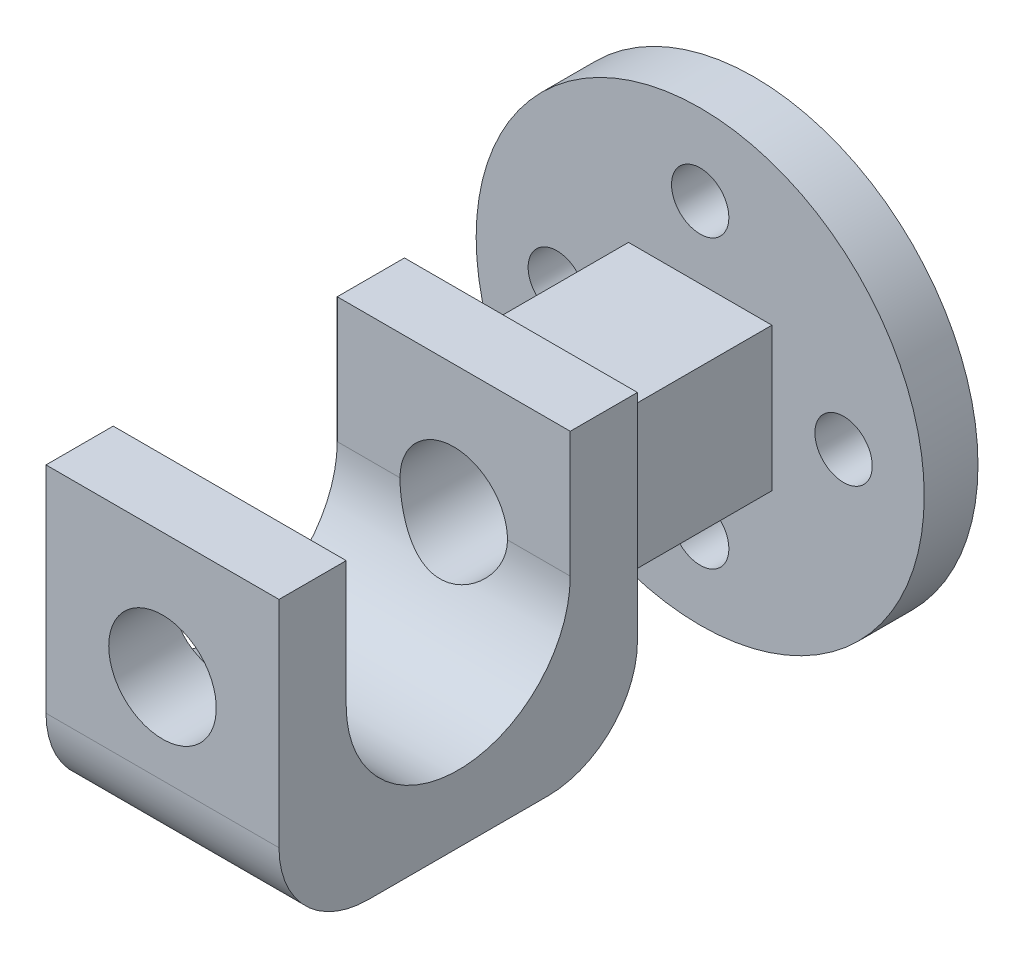
ISO-10303-21;
HEADER;
FILE_DESCRIPTION(('STEP AP214'),'2;1');
FILE_NAME('part.step','',(''),(''),'','','');
FILE_SCHEMA(('AUTOMOTIVE_DESIGN { 1 0 10303 214 1 1 1 1 }'));
ENDSEC;
DATA;
#1=APPLICATION_CONTEXT('core data for automotive mechanical design processes');
#2=APPLICATION_PROTOCOL_DEFINITION('international standard','automotive_design',2000,#1);
#3=PRODUCT_CONTEXT('',#1,'mechanical');
#4=PRODUCT('Part','Part','',(#3));
#5=PRODUCT_RELATED_PRODUCT_CATEGORY('part','',(#4));
#6=PRODUCT_DEFINITION_FORMATION('','',#4);
#7=PRODUCT_DEFINITION_CONTEXT('part definition',#1,'design');
#8=PRODUCT_DEFINITION('design','',#6,#7);
#9=PRODUCT_DEFINITION_SHAPE('','',#8);
#10=(LENGTH_UNIT() NAMED_UNIT(*) SI_UNIT(.MILLI.,.METRE.));
#11=(NAMED_UNIT(*) PLANE_ANGLE_UNIT() SI_UNIT($,.RADIAN.));
#12=(NAMED_UNIT(*) SI_UNIT($,.STERADIAN.) SOLID_ANGLE_UNIT());
#13=UNCERTAINTY_MEASURE_WITH_UNIT(LENGTH_MEASURE(1.E-05),#10,'distance_accuracy_value','');
#14=(GEOMETRIC_REPRESENTATION_CONTEXT(3) GLOBAL_UNCERTAINTY_ASSIGNED_CONTEXT((#13)) GLOBAL_UNIT_ASSIGNED_CONTEXT((#10,
#11,#12)) REPRESENTATION_CONTEXT('',''));
#15=CARTESIAN_POINT('',(0.,0.,0.));
#16=DIRECTION('',(0.,0.,1.));
#17=DIRECTION('',(1.,0.,0.));
#18=AXIS2_PLACEMENT_3D('',#15,#16,#17);
#19=CARTESIAN_POINT('',(0.,0.,3.));
#20=DIRECTION('',(0.,0.,1.));
#21=DIRECTION('',(1.,0.,0.));
#22=AXIS2_PLACEMENT_3D('',#19,#20,#21);
#23=PLANE('',#22);
#24=CARTESIAN_POINT('',(4.51808198568511E-13,-8.,3.));
#25=DIRECTION('',(0.,0.,1.));
#26=DIRECTION('',(1.,0.,0.));
#27=AXIS2_PLACEMENT_3D('',#24,#25,#26);
#28=CIRCLE('',#27,1.6);
#29=CARTESIAN_POINT('',(1.60000000000045,-8.,3.));
#30=VERTEX_POINT('',#29);
#31=EDGE_CURVE('E218',#30,#30,#28,.T.);
#32=ORIENTED_EDGE('',*,*,#31,.F.);
#33=EDGE_LOOP('',(#32));
#34=FACE_BOUND('',#33,.T.);
#35=CARTESIAN_POINT('',(0.,8.,3.));
#36=DIRECTION('',(0.,0.,1.));
#37=DIRECTION('',(1.,0.,0.));
#38=AXIS2_PLACEMENT_3D('',#35,#36,#37);
#39=CIRCLE('',#38,1.6);
#40=CARTESIAN_POINT('',(1.6,8.,3.));
#41=VERTEX_POINT('',#40);
#42=EDGE_CURVE('E230',#41,#41,#39,.T.);
#43=ORIENTED_EDGE('',*,*,#42,.F.);
#44=EDGE_LOOP('',(#43));
#45=FACE_BOUND('',#44,.T.);
#46=CARTESIAN_POINT('',(0.,0.,3.));
#47=DIRECTION('',(0.,0.,1.));
#48=DIRECTION('',(1.,0.,0.));
#49=AXIS2_PLACEMENT_3D('',#46,#47,#48);
#50=CIRCLE('',#49,12.5);
#51=CARTESIAN_POINT('',(12.5,0.,3.));
#52=VERTEX_POINT('',#51);
#53=EDGE_CURVE('E236',#52,#52,#50,.T.);
#54=ORIENTED_EDGE('',*,*,#53,.T.);
#55=EDGE_LOOP('',(#54));
#56=FACE_BOUND('',#55,.T.);
#57=CARTESIAN_POINT('',(8.00000000000023,2.25904099284255E-13,3.));
#58=DIRECTION('',(0.,0.,1.));
#59=DIRECTION('',(1.,0.,0.));
#60=AXIS2_PLACEMENT_3D('',#57,#58,#59);
#61=CIRCLE('',#60,1.6);
#62=CARTESIAN_POINT('',(9.60000000000023,2.25904099284255E-13,3.));
#63=VERTEX_POINT('',#62);
#64=EDGE_CURVE('E224',#63,#63,#61,.T.);
#65=ORIENTED_EDGE('',*,*,#64,.F.);
#66=EDGE_LOOP('',(#65));
#67=FACE_BOUND('',#66,.T.);
#68=CARTESIAN_POINT('',(-7.99999999999977,-2.26883816723573E-13,3.));
#69=DIRECTION('',(0.,0.,1.));
#70=DIRECTION('',(1.,0.,0.));
#71=AXIS2_PLACEMENT_3D('',#68,#69,#70);
#72=CIRCLE('',#71,1.6);
#73=CARTESIAN_POINT('',(-6.39999999999977,-2.26883816723573E-13,3.));
#74=VERTEX_POINT('',#73);
#75=EDGE_CURVE('E212',#74,#74,#72,.T.);
#76=ORIENTED_EDGE('',*,*,#75,.F.);
#77=EDGE_LOOP('',(#76));
#78=FACE_BOUND('',#77,.T.);
#79=DIRECTION('',(1.,0.,0.));
#80=VECTOR('',#79,1.);
#81=CARTESIAN_POINT('',(4.,-4.,3.));
#82=LINE('',#81,#80);
#83=CARTESIAN_POINT('',(-4.,-4.,3.));
#84=VERTEX_POINT('',#83);
#85=CARTESIAN_POINT('',(4.,-4.,3.));
#86=VERTEX_POINT('',#85);
#87=EDGE_CURVE('E196',#84,#86,#82,.T.);
#88=ORIENTED_EDGE('',*,*,#87,.F.);
#89=DIRECTION('',(0.,-1.,0.));
#90=VECTOR('',#89,1.);
#91=CARTESIAN_POINT('',(-4.,-4.,3.));
#92=LINE('',#91,#90);
#93=CARTESIAN_POINT('',(-4.,4.,3.));
#94=VERTEX_POINT('',#93);
#95=EDGE_CURVE('E179',#94,#84,#92,.T.);
#96=ORIENTED_EDGE('',*,*,#95,.F.);
#97=DIRECTION('',(-1.,0.,0.));
#98=VECTOR('',#97,1.);
#99=CARTESIAN_POINT('',(4.,4.,3.));
#100=LINE('',#99,#98);
#101=CARTESIAN_POINT('',(4.,4.,3.));
#102=VERTEX_POINT('',#101);
#103=EDGE_CURVE('E184',#102,#94,#100,.T.);
#104=ORIENTED_EDGE('',*,*,#103,.F.);
#105=DIRECTION('',(0.,1.,0.));
#106=VECTOR('',#105,1.);
#107=CARTESIAN_POINT('',(4.,-4.,3.));
#108=LINE('',#107,#106);
#109=EDGE_CURVE('E198',#86,#102,#108,.T.);
#110=ORIENTED_EDGE('',*,*,#109,.F.);
#111=EDGE_LOOP('',(#88,#96,#104,#110));
#112=FACE_BOUND('',#111,.T.);
#113=ADVANCED_FACE('F35',(#34,#45,#56,#67,#78,#112),#23,.T.);
#114=CARTESIAN_POINT('',(0.,0.,0.));
#115=DIRECTION('',(0.,0.,1.));
#116=DIRECTION('',(1.,0.,0.));
#117=AXIS2_PLACEMENT_3D('',#114,#115,#116);
#118=PLANE('',#117);
#119=CARTESIAN_POINT('',(0.,0.,0.));
#120=DIRECTION('',(0.,0.,-1.));
#121=DIRECTION('',(-1.,0.,0.));
#122=AXIS2_PLACEMENT_3D('',#119,#120,#121);
#123=CIRCLE('',#122,3.);
#124=CARTESIAN_POINT('',(-3.,0.,0.));
#125=VERTEX_POINT('',#124);
#126=EDGE_CURVE('E604',#125,#125,#123,.T.);
#127=ORIENTED_EDGE('',*,*,#126,.F.);
#128=EDGE_LOOP('',(#127));
#129=FACE_BOUND('',#128,.T.);
#130=CARTESIAN_POINT('',(0.,0.,0.));
#131=DIRECTION('',(0.,0.,1.));
#132=DIRECTION('',(1.,0.,0.));
#133=AXIS2_PLACEMENT_3D('',#130,#131,#132);
#134=CIRCLE('',#133,12.5);
#135=CARTESIAN_POINT('',(12.5,0.,0.));
#136=VERTEX_POINT('',#135);
#137=EDGE_CURVE('E233',#136,#136,#134,.T.);
#138=ORIENTED_EDGE('',*,*,#137,.F.);
#139=EDGE_LOOP('',(#138));
#140=FACE_BOUND('',#139,.T.);
#141=CARTESIAN_POINT('',(0.,8.,0.));
#142=DIRECTION('',(0.,0.,1.));
#143=DIRECTION('',(1.,0.,0.));
#144=AXIS2_PLACEMENT_3D('',#141,#142,#143);
#145=CIRCLE('',#144,1.6);
#146=CARTESIAN_POINT('',(1.6,8.,0.));
#147=VERTEX_POINT('',#146);
#148=EDGE_CURVE('E227',#147,#147,#145,.T.);
#149=ORIENTED_EDGE('',*,*,#148,.T.);
#150=EDGE_LOOP('',(#149));
#151=FACE_BOUND('',#150,.T.);
#152=CARTESIAN_POINT('',(8.00000000000023,2.25904099284255E-13,0.));
#153=DIRECTION('',(0.,0.,1.));
#154=DIRECTION('',(1.,0.,0.));
#155=AXIS2_PLACEMENT_3D('',#152,#153,#154);
#156=CIRCLE('',#155,1.6);
#157=CARTESIAN_POINT('',(9.60000000000023,2.25904099284255E-13,0.));
#158=VERTEX_POINT('',#157);
#159=EDGE_CURVE('E221',#158,#158,#156,.T.);
#160=ORIENTED_EDGE('',*,*,#159,.T.);
#161=EDGE_LOOP('',(#160));
#162=FACE_BOUND('',#161,.T.);
#163=CARTESIAN_POINT('',(4.51808198568511E-13,-8.,0.));
#164=DIRECTION('',(0.,0.,1.));
#165=DIRECTION('',(1.,0.,0.));
#166=AXIS2_PLACEMENT_3D('',#163,#164,#165);
#167=CIRCLE('',#166,1.6);
#168=CARTESIAN_POINT('',(1.60000000000045,-8.,0.));
#169=VERTEX_POINT('',#168);
#170=EDGE_CURVE('E215',#169,#169,#167,.T.);
#171=ORIENTED_EDGE('',*,*,#170,.T.);
#172=EDGE_LOOP('',(#171));
#173=FACE_BOUND('',#172,.T.);
#174=CARTESIAN_POINT('',(-7.99999999999977,-2.26883816723573E-13,0.));
#175=DIRECTION('',(0.,0.,1.));
#176=DIRECTION('',(1.,0.,0.));
#177=AXIS2_PLACEMENT_3D('',#174,#175,#176);
#178=CIRCLE('',#177,1.6);
#179=CARTESIAN_POINT('',(-6.39999999999977,-2.26883816723573E-13,0.));
#180=VERTEX_POINT('',#179);
#181=EDGE_CURVE('E211',#180,#180,#178,.T.);
#182=ORIENTED_EDGE('',*,*,#181,.T.);
#183=EDGE_LOOP('',(#182));
#184=FACE_BOUND('',#183,.T.);
#185=ADVANCED_FACE('F373',(#129,#140,#151,#162,#173,#184),#118,.F.);
#186=CARTESIAN_POINT('',(0.,0.,3.));
#187=DIRECTION('',(0.,0.,-1.));
#188=DIRECTION('',(-1.,0.,0.));
#189=AXIS2_PLACEMENT_3D('',#186,#187,#188);
#190=CYLINDRICAL_SURFACE('',#189,12.5);
#191=ORIENTED_EDGE('',*,*,#53,.F.);
#192=EDGE_LOOP('',(#191));
#193=FACE_BOUND('',#192,.T.);
#194=ORIENTED_EDGE('',*,*,#137,.T.);
#195=EDGE_LOOP('',(#194));
#196=FACE_BOUND('',#195,.T.);
#197=ADVANCED_FACE('F379',(#193,#196),#190,.T.);
#198=CARTESIAN_POINT('',(0.,8.,3.));
#199=DIRECTION('',(0.,0.,-1.));
#200=DIRECTION('',(-1.,0.,0.));
#201=AXIS2_PLACEMENT_3D('',#198,#199,#200);
#202=CYLINDRICAL_SURFACE('',#201,1.6);
#203=ORIENTED_EDGE('',*,*,#42,.T.);
#204=EDGE_LOOP('',(#203));
#205=FACE_BOUND('',#204,.T.);
#206=ORIENTED_EDGE('',*,*,#148,.F.);
#207=EDGE_LOOP('',(#206));
#208=FACE_BOUND('',#207,.T.);
#209=ADVANCED_FACE('F385',(#205,#208),#202,.F.);
#210=CARTESIAN_POINT('',(8.00000000000023,2.25904099284255E-13,3.));
#211=DIRECTION('',(0.,0.,-1.));
#212=DIRECTION('',(-1.,0.,0.));
#213=AXIS2_PLACEMENT_3D('',#210,#211,#212);
#214=CYLINDRICAL_SURFACE('',#213,1.6);
#215=ORIENTED_EDGE('',*,*,#64,.T.);
#216=EDGE_LOOP('',(#215));
#217=FACE_BOUND('',#216,.T.);
#218=ORIENTED_EDGE('',*,*,#159,.F.);
#219=EDGE_LOOP('',(#218));
#220=FACE_BOUND('',#219,.T.);
#221=ADVANCED_FACE('F545',(#217,#220),#214,.F.);
#222=CARTESIAN_POINT('',(4.51808198568511E-13,-8.,3.));
#223=DIRECTION('',(0.,0.,-1.));
#224=DIRECTION('',(-1.,0.,0.));
#225=AXIS2_PLACEMENT_3D('',#222,#223,#224);
#226=CYLINDRICAL_SURFACE('',#225,1.6);
#227=ORIENTED_EDGE('',*,*,#31,.T.);
#228=EDGE_LOOP('',(#227));
#229=FACE_BOUND('',#228,.T.);
#230=ORIENTED_EDGE('',*,*,#170,.F.);
#231=EDGE_LOOP('',(#230));
#232=FACE_BOUND('',#231,.T.);
#233=ADVANCED_FACE('F535',(#229,#232),#226,.F.);
#234=CARTESIAN_POINT('',(-7.99999999999977,-2.26883816723573E-13,3.));
#235=DIRECTION('',(0.,0.,-1.));
#236=DIRECTION('',(-1.,0.,0.));
#237=AXIS2_PLACEMENT_3D('',#234,#235,#236);
#238=CYLINDRICAL_SURFACE('',#237,1.6);
#239=ORIENTED_EDGE('',*,*,#75,.T.);
#240=EDGE_LOOP('',(#239));
#241=FACE_BOUND('',#240,.T.);
#242=ORIENTED_EDGE('',*,*,#181,.F.);
#243=EDGE_LOOP('',(#242));
#244=FACE_BOUND('',#243,.T.);
#245=ADVANCED_FACE('F520',(#241,#244),#238,.F.);
#246=CARTESIAN_POINT('',(-4.,-4.,13.));
#247=DIRECTION('',(1.,0.,0.));
#248=DIRECTION('',(0.,0.,-1.));
#249=AXIS2_PLACEMENT_3D('',#246,#247,#248);
#250=PLANE('',#249);
#251=ORIENTED_EDGE('',*,*,#95,.T.);
#252=DIRECTION('',(0.,0.,-1.));
#253=VECTOR('',#252,1.);
#254=CARTESIAN_POINT('',(-4.,-4.,13.));
#255=LINE('',#254,#253);
#256=CARTESIAN_POINT('',(-4.,-4.,13.));
#257=VERTEX_POINT('',#256);
#258=EDGE_CURVE('E209',#257,#84,#255,.T.);
#259=ORIENTED_EDGE('',*,*,#258,.F.);
#260=DIRECTION('',(0.,-1.,0.));
#261=VECTOR('',#260,1.);
#262=CARTESIAN_POINT('',(-4.,-4.,13.));
#263=LINE('',#262,#261);
#264=CARTESIAN_POINT('',(-4.,4.,13.));
#265=VERTEX_POINT('',#264);
#266=EDGE_CURVE('E180',#265,#257,#263,.T.);
#267=ORIENTED_EDGE('',*,*,#266,.F.);
#268=DIRECTION('',(0.,0.,-1.));
#269=VECTOR('',#268,1.);
#270=CARTESIAN_POINT('',(-4.,4.,13.));
#271=LINE('',#270,#269);
#272=EDGE_CURVE('E193',#265,#94,#271,.T.);
#273=ORIENTED_EDGE('',*,*,#272,.T.);
#274=EDGE_LOOP('',(#251,#259,#267,#273));
#275=FACE_BOUND('',#274,.T.);
#276=ADVANCED_FACE('F511',(#275),#250,.F.);
#277=CARTESIAN_POINT('',(4.,-4.,13.));
#278=DIRECTION('',(0.,1.,0.));
#279=DIRECTION('',(0.,0.,1.));
#280=AXIS2_PLACEMENT_3D('',#277,#278,#279);
#281=PLANE('',#280);
#282=ORIENTED_EDGE('',*,*,#87,.T.);
#283=DIRECTION('',(0.,0.,-1.));
#284=VECTOR('',#283,1.);
#285=CARTESIAN_POINT('',(4.,-4.,13.));
#286=LINE('',#285,#284);
#287=CARTESIAN_POINT('',(4.,-4.,13.));
#288=VERTEX_POINT('',#287);
#289=EDGE_CURVE('E206',#288,#86,#286,.T.);
#290=ORIENTED_EDGE('',*,*,#289,.F.);
#291=DIRECTION('',(1.,0.,0.));
#292=VECTOR('',#291,1.);
#293=CARTESIAN_POINT('',(4.,-4.,13.));
#294=LINE('',#293,#292);
#295=EDGE_CURVE('E183',#257,#288,#294,.T.);
#296=ORIENTED_EDGE('',*,*,#295,.F.);
#297=ORIENTED_EDGE('',*,*,#258,.T.);
#298=EDGE_LOOP('',(#282,#290,#296,#297));
#299=FACE_BOUND('',#298,.T.);
#300=ADVANCED_FACE('F501',(#299),#281,.F.);
#301=CARTESIAN_POINT('',(4.,-4.,13.));
#302=DIRECTION('',(-1.,0.,0.));
#303=DIRECTION('',(0.,0.,1.));
#304=AXIS2_PLACEMENT_3D('',#301,#302,#303);
#305=PLANE('',#304);
#306=ORIENTED_EDGE('',*,*,#109,.T.);
#307=DIRECTION('',(0.,0.,-1.));
#308=VECTOR('',#307,1.);
#309=CARTESIAN_POINT('',(4.,4.,13.));
#310=LINE('',#309,#308);
#311=CARTESIAN_POINT('',(4.,4.,13.));
#312=VERTEX_POINT('',#311);
#313=EDGE_CURVE('E204',#312,#102,#310,.T.);
#314=ORIENTED_EDGE('',*,*,#313,.F.);
#315=DIRECTION('',(0.,1.,0.));
#316=VECTOR('',#315,1.);
#317=CARTESIAN_POINT('',(4.,-4.,13.));
#318=LINE('',#317,#316);
#319=EDGE_CURVE('E187',#288,#312,#318,.T.);
#320=ORIENTED_EDGE('',*,*,#319,.F.);
#321=ORIENTED_EDGE('',*,*,#289,.T.);
#322=EDGE_LOOP('',(#306,#314,#320,#321));
#323=FACE_BOUND('',#322,.T.);
#324=ADVANCED_FACE('F491',(#323),#305,.F.);
#325=CARTESIAN_POINT('',(4.,4.,13.));
#326=DIRECTION('',(0.,-1.,0.));
#327=DIRECTION('',(0.,0.,-1.));
#328=AXIS2_PLACEMENT_3D('',#325,#326,#327);
#329=PLANE('',#328);
#330=ORIENTED_EDGE('',*,*,#103,.T.);
#331=ORIENTED_EDGE('',*,*,#272,.F.);
#332=DIRECTION('',(-1.,0.,0.));
#333=VECTOR('',#332,1.);
#334=CARTESIAN_POINT('',(4.,4.,13.));
#335=LINE('',#334,#333);
#336=EDGE_CURVE('E190',#312,#265,#335,.T.);
#337=ORIENTED_EDGE('',*,*,#336,.F.);
#338=ORIENTED_EDGE('',*,*,#313,.T.);
#339=EDGE_LOOP('',(#330,#331,#337,#338));
#340=FACE_BOUND('',#339,.T.);
#341=ADVANCED_FACE('F361',(#340),#329,.F.);
#342=CARTESIAN_POINT('',(6.5,0.,13.));
#343=DIRECTION('',(0.,0.,1.));
#344=DIRECTION('',(1.,0.,0.));
#345=AXIS2_PLACEMENT_3D('',#342,#343,#344);
#346=PLANE('',#345);
#347=DIRECTION('',(0.,1.,0.));
#348=VECTOR('',#347,1.);
#349=CARTESIAN_POINT('',(6.5,0.,13.));
#350=LINE('',#349,#348);
#351=CARTESIAN_POINT('',(6.5,-5.,13.));
#352=VERTEX_POINT('',#351);
#353=CARTESIAN_POINT('',(6.5,7.,13.));
#354=VERTEX_POINT('',#353);
#355=EDGE_CURVE('E257',#352,#354,#350,.T.);
#356=ORIENTED_EDGE('',*,*,#355,.F.);
#357=DIRECTION('',(-1.,0.,0.));
#358=VECTOR('',#357,1.);
#359=CARTESIAN_POINT('',(6.5,-5.,13.));
#360=LINE('',#359,#358);
#361=CARTESIAN_POINT('',(-6.5,-5.,13.));
#362=VERTEX_POINT('',#361);
#363=EDGE_CURVE('E239',#352,#362,#360,.T.);
#364=ORIENTED_EDGE('',*,*,#363,.T.);
#365=DIRECTION('',(0.,1.,0.));
#366=VECTOR('',#365,1.);
#367=CARTESIAN_POINT('',(-6.5,0.,13.));
#368=LINE('',#367,#366);
#369=CARTESIAN_POINT('',(-6.5,7.,13.));
#370=VERTEX_POINT('',#369);
#371=EDGE_CURVE('E277',#362,#370,#368,.T.);
#372=ORIENTED_EDGE('',*,*,#371,.T.);
#373=DIRECTION('',(-1.,0.,0.));
#374=VECTOR('',#373,1.);
#375=CARTESIAN_POINT('',(6.5,7.,13.));
#376=LINE('',#375,#374);
#377=EDGE_CURVE('E267',#354,#370,#376,.T.);
#378=ORIENTED_EDGE('',*,*,#377,.F.);
#379=EDGE_LOOP('',(#356,#364,#372,#378));
#380=FACE_BOUND('',#379,.T.);
#381=ORIENTED_EDGE('',*,*,#336,.T.);
#382=ORIENTED_EDGE('',*,*,#266,.T.);
#383=ORIENTED_EDGE('',*,*,#295,.T.);
#384=ORIENTED_EDGE('',*,*,#319,.T.);
#385=EDGE_LOOP('',(#381,#382,#383,#384));
#386=FACE_BOUND('',#385,.T.);
#387=ADVANCED_FACE('F263',(#380,#386),#346,.F.);
#388=CARTESIAN_POINT('',(6.5,0.,16.75));
#389=DIRECTION('',(0.,0.,1.));
#390=DIRECTION('',(1.,0.,0.));
#391=AXIS2_PLACEMENT_3D('',#388,#389,#390);
#392=PLANE('',#391);
#393=CARTESIAN_POINT('',(0.,0.,16.75));
#394=DIRECTION('',(0.,0.,1.));
#395=DIRECTION('',(1.,0.,0.));
#396=AXIS2_PLACEMENT_3D('',#393,#394,#395);
#397=CIRCLE('',#396,3.);
#398=CARTESIAN_POINT('',(3.,0.,16.75));
#399=VERTEX_POINT('',#398);
#400=CARTESIAN_POINT('',(-3.,0.,16.75));
#401=VERTEX_POINT('',#400);
#402=EDGE_CURVE('E318',#399,#401,#397,.T.);
#403=ORIENTED_EDGE('',*,*,#402,.F.);
#404=DIRECTION('',(-1.,0.,0.));
#405=VECTOR('',#404,1.);
#406=CARTESIAN_POINT('',(6.5,0.,16.75));
#407=LINE('',#406,#405);
#408=CARTESIAN_POINT('',(6.5,0.,16.75));
#409=VERTEX_POINT('',#408);
#410=EDGE_CURVE('E172',#409,#399,#407,.T.);
#411=ORIENTED_EDGE('',*,*,#410,.F.);
#412=DIRECTION('',(0.,1.,0.));
#413=VECTOR('',#412,1.);
#414=CARTESIAN_POINT('',(6.5,0.,16.75));
#415=LINE('',#414,#413);
#416=CARTESIAN_POINT('',(6.5,7.,16.75));
#417=VERTEX_POINT('',#416);
#418=EDGE_CURVE('E307',#409,#417,#415,.T.);
#419=ORIENTED_EDGE('',*,*,#418,.T.);
#420=DIRECTION('',(-1.,0.,0.));
#421=VECTOR('',#420,1.);
#422=CARTESIAN_POINT('',(6.5,7.,16.75));
#423=LINE('',#422,#421);
#424=CARTESIAN_POINT('',(-6.5,7.,16.75));
#425=VERTEX_POINT('',#424);
#426=EDGE_CURVE('E288',#417,#425,#423,.T.);
#427=ORIENTED_EDGE('',*,*,#426,.T.);
#428=DIRECTION('',(0.,1.,0.));
#429=VECTOR('',#428,1.);
#430=CARTESIAN_POINT('',(-6.5,0.,16.75));
#431=LINE('',#430,#429);
#432=CARTESIAN_POINT('',(-6.5,0.,16.75));
#433=VERTEX_POINT('',#432);
#434=EDGE_CURVE('E326',#433,#425,#431,.T.);
#435=ORIENTED_EDGE('',*,*,#434,.F.);
#436=EDGE_CURVE('E170',#401,#433,#407,.T.);
#437=ORIENTED_EDGE('',*,*,#436,.F.);
#438=EDGE_LOOP('',(#403,#411,#419,#427,#435,#437));
#439=FACE_BOUND('',#438,.T.);
#440=ADVANCED_FACE('F332',(#439),#392,.T.);
#441=CARTESIAN_POINT('',(6.5,0.,23.));
#442=DIRECTION('',(-1.,0.,0.));
#443=DIRECTION('',(0.,0.,1.));
#444=AXIS2_PLACEMENT_3D('',#441,#442,#443);
#445=CYLINDRICAL_SURFACE('',#444,6.25);
#446=DIRECTION('',(-1.,0.,0.));
#447=VECTOR('',#446,1.);
#448=CARTESIAN_POINT('',(6.5,0.,29.25));
#449=LINE('',#448,#447);
#450=CARTESIAN_POINT('',(-3.,0.,29.25));
#451=VERTEX_POINT('',#450);
#452=CARTESIAN_POINT('',(-6.5,0.,29.25));
#453=VERTEX_POINT('',#452);
#454=EDGE_CURVE('E164',#451,#453,#449,.T.);
#455=ORIENTED_EDGE('',*,*,#454,.F.);
#456=CARTESIAN_POINT('',(-3.,0.,29.25));
#457=CARTESIAN_POINT('',(-3.00001245076569,-0.0795727980072077,29.2500137051725));
#458=CARTESIAN_POINT('',(-2.99683442477228,-0.159136872885846,29.2484807197392));
#459=CARTESIAN_POINT('',(-2.98419413907302,-0.317620229081252,29.242424079396));
#460=CARTESIAN_POINT('',(-2.9747342699232,-0.396539744124614,29.2379015621557));
#461=CARTESIAN_POINT('',(-2.94968086619488,-0.552831303369944,29.2259940828864));
#462=CARTESIAN_POINT('',(-2.93411388251769,-0.630208542646207,29.218621513564));
#463=CARTESIAN_POINT('',(-2.89703311773028,-0.783200337505499,29.2012124361712));
#464=CARTESIAN_POINT('',(-2.87551899426181,-0.85881479133867,29.1911757747386));
#465=CARTESIAN_POINT('',(-2.80241827971651,-1.0820822320179,29.157446570311));
#466=CARTESIAN_POINT('',(-2.74222227728749,-1.22647231904135,29.130109502085));
#467=CARTESIAN_POINT('',(-2.60099960343525,-1.50299284330142,29.0682518670295));
#468=CARTESIAN_POINT('',(-2.51995314996953,-1.63511147497983,29.0337244842879));
#469=CARTESIAN_POINT('',(-2.33409743652803,-1.89168116539555,28.9584306988498));
#470=CARTESIAN_POINT('',(-2.22820390953055,-2.01527664850247,28.917421949321));
#471=CARTESIAN_POINT('',(-1.99802761686111,-2.24370998504067,28.8346430986891));
#472=CARTESIAN_POINT('',(-1.87373404668603,-2.34853673702296,28.7928725629872));
#473=CARTESIAN_POINT('',(-1.59966055936623,-2.54387062248256,28.7099272498552));
#474=CARTESIAN_POINT('',(-1.44870515066789,-2.63285998755468,28.6689992387701));
#475=CARTESIAN_POINT('',(-1.21121643329723,-2.74602894635535,28.614586269687));
#476=CARTESIAN_POINT('',(-1.13018180103373,-2.78037421765004,28.5976072510656));
#477=CARTESIAN_POINT('',(-0.964924693274119,-2.84194992754954,28.5665976560479));
#478=CARTESIAN_POINT('',(-0.880704068318735,-2.86918442585486,28.5525653981789));
#479=CARTESIAN_POINT('',(-0.714589380236246,-2.91485084803937,28.5287223472338));
#480=CARTESIAN_POINT('',(-0.632836802851594,-2.93369639913709,28.5187163533603));
#481=CARTESIAN_POINT('',(-0.46773117958444,-2.96450248858219,28.5022296080765));
#482=CARTESIAN_POINT('',(-0.38437897437363,-2.97646654630409,28.4957470547808));
#483=CARTESIAN_POINT('',(-0.216788656055399,-2.99334061018274,28.486575218358));
#484=CARTESIAN_POINT('',(-0.132550983381156,-2.99825397030232,28.4838841316705));
#485=CARTESIAN_POINT('',(0.0360460091947705,-3.000969878498,28.4823966060118));
#486=CARTESIAN_POINT('',(0.120405318454172,-2.99877301491566,28.4835998448012));
#487=CARTESIAN_POINT('',(0.354319404546739,-2.98277580352215,28.4923354863915));
#488=CARTESIAN_POINT('',(0.503274338433684,-2.9612455831354,28.5040811499361));
#489=CARTESIAN_POINT('',(0.795024389093679,-2.89660559673628,28.5383633045511));
#490=CARTESIAN_POINT('',(0.937817902955372,-2.85349025161907,28.5609025853811));
#491=CARTESIAN_POINT('',(1.21734520934421,-2.7460886281965,28.6147279297702));
#492=CARTESIAN_POINT('',(1.35386078640737,-2.68133322380907,28.6462052558577));
#493=CARTESIAN_POINT('',(1.61471370649524,-2.53283646177105,28.7143596280545));
#494=CARTESIAN_POINT('',(1.73904530361405,-2.4490862073608,28.7510391077094));
#495=CARTESIAN_POINT('',(1.98714020374078,-2.25366144197828,28.8305968391646));
#496=CARTESIAN_POINT('',(2.10917655232089,-2.13987813841963,28.8737015256982));
#497=CARTESIAN_POINT('',(2.33312110478298,-1.8932337567995,28.9577822554324));
#498=CARTESIAN_POINT('',(2.43501970309783,-1.76036362638419,28.9987572759626));
#499=CARTESIAN_POINT('',(2.61962775075892,-1.47237167116613,29.0759869513186));
#500=CARTESIAN_POINT('',(2.70140190137416,-1.31657038023582,29.1119858576715));
#501=CARTESIAN_POINT('',(2.80298255768832,-1.07287433301495,29.1577854314647));
#502=CARTESIAN_POINT('',(2.83332510931989,-0.989995433386924,29.171683394496));
#503=CARTESIAN_POINT('',(2.88668881954599,-0.821479286513853,29.1963625041115));
#504=CARTESIAN_POINT('',(2.90971283369923,-0.735843129498907,29.207144866196));
#505=CARTESIAN_POINT('',(2.95243511899971,-0.543067245093317,29.2272735623972));
#506=CARTESIAN_POINT('',(2.97023579872184,-0.435404351398986,29.2357584177336));
#507=CARTESIAN_POINT('',(2.98807413334399,-0.272759903271128,29.2442825058019));
#508=CARTESIAN_POINT('',(2.99254314281699,-0.218331710720166,29.2464233501697));
#509=CARTESIAN_POINT('',(2.9985063885262,-0.10927401716453,29.2492828918628));
#510=CARTESIAN_POINT('',(3.00000054512065,-0.0546445108095768,29.2500015511138));
#511=CARTESIAN_POINT('',(3.,0.,29.25));
#512=B_SPLINE_CURVE_WITH_KNOTS('',3,(#456,#457,#458,#459,#460,#461,#462,#463,#464,#465,#466,
#467,#468,#469,#470,#471,#472,#473,#474,#475,#476,#477,#478,#479,#480,#481,#482,#483,#484,#485,
#486,#487,#488,#489,#490,#491,#492,#493,#494,#495,#496,#497,#498,#499,#500,#501,#502,#503,#504,
#505,#506,#507,#508,#509,#510,#511),.UNSPECIFIED.,.F.,.F.,(4,2,2,2,2,2,2,2,2,2,2,2,2,2,2,2,2,2,
2,2,2,2,2,2,2,2,2,4),(0.,0.238625662947122,0.477160568875672,0.714669727616936,
0.952192561866246,1.42629578768471,1.90085049254598,2.40223017994889,2.90390545390129,
3.44072816544325,3.70932031352564,3.97775877931818,4.23087903427109,4.48386972158098,
4.7367400232205,4.98958940142508,5.44014788404899,5.8908228826458,6.35198097601017,
6.81335551313189,7.32806135395267,7.84301211643932,8.37864928047779,8.64635332969676,
8.9139527971362,9.24144297351067,9.40531736659574,9.56919614681098),.UNSPECIFIED.);
#513=CARTESIAN_POINT('',(3.,0.,29.25));
#514=VERTEX_POINT('',#513);
#515=EDGE_CURVE('E151',#451,#514,#512,.T.);
#516=ORIENTED_EDGE('',*,*,#515,.T.);
#517=CARTESIAN_POINT('',(6.5,0.,29.25));
#518=VERTEX_POINT('',#517);
#519=EDGE_CURVE('E161',#518,#514,#449,.T.);
#520=ORIENTED_EDGE('',*,*,#519,.F.);
#521=CARTESIAN_POINT('',(6.5,0.,23.));
#522=DIRECTION('',(1.,0.,0.));
#523=DIRECTION('',(0.,0.,-1.));
#524=AXIS2_PLACEMENT_3D('',#521,#522,#523);
#525=CIRCLE('',#524,6.25);
#526=EDGE_CURVE('E312',#409,#518,#525,.F.);
#527=ORIENTED_EDGE('',*,*,#526,.F.);
#528=ORIENTED_EDGE('',*,*,#410,.T.);
#529=CARTESIAN_POINT('',(3.,0.,16.75));
#530=CARTESIAN_POINT('',(3.00001245076569,-0.0795727980072067,16.7499862948275));
#531=CARTESIAN_POINT('',(2.99683442477228,-0.159136872885845,16.7515192802608));
#532=CARTESIAN_POINT('',(2.98419413907302,-0.317620229081251,16.757575920604));
#533=CARTESIAN_POINT('',(2.9747342699232,-0.396539744124613,16.7620984378443));
#534=CARTESIAN_POINT('',(2.94968086619488,-0.552831303369943,16.7740059171136));
#535=CARTESIAN_POINT('',(2.93411388251769,-0.630208542646206,16.781378486436));
#536=CARTESIAN_POINT('',(2.89703311773028,-0.783200337505498,16.7987875638288));
#537=CARTESIAN_POINT('',(2.87551899426181,-0.85881479133867,16.8088242252614));
#538=CARTESIAN_POINT('',(2.80241827971651,-1.0820822320179,16.842553429689));
#539=CARTESIAN_POINT('',(2.74222227728749,-1.22647231904135,16.869890497915));
#540=CARTESIAN_POINT('',(2.60099960343525,-1.50299284330142,16.9317481329705));
#541=CARTESIAN_POINT('',(2.51995314996953,-1.63511147497983,16.9662755157121));
#542=CARTESIAN_POINT('',(2.33409743652803,-1.89168116539555,17.0415693011502));
#543=CARTESIAN_POINT('',(2.22820390953055,-2.01527664850247,17.082578050679));
#544=CARTESIAN_POINT('',(1.99802761686111,-2.24370998504067,17.1653569013109));
#545=CARTESIAN_POINT('',(1.87373404668603,-2.34853673702296,17.2071274370128));
#546=CARTESIAN_POINT('',(1.59966055936623,-2.54387062248255,17.2900727501448));
#547=CARTESIAN_POINT('',(1.4487051506679,-2.63285998755468,17.3310007612299));
#548=CARTESIAN_POINT('',(1.21121643329724,-2.74602894635535,17.385413730313));
#549=CARTESIAN_POINT('',(1.13018180103373,-2.78037421765004,17.4023927489344));
#550=CARTESIAN_POINT('',(0.964924693274119,-2.84194992754954,17.4334023439521));
#551=CARTESIAN_POINT('',(0.880704068318736,-2.86918442585486,17.4474346018211));
#552=CARTESIAN_POINT('',(0.714589380236247,-2.91485084803937,17.4712776527662));
#553=CARTESIAN_POINT('',(0.632836802851594,-2.93369639913709,17.4812836466397));
#554=CARTESIAN_POINT('',(0.467731179584439,-2.96450248858219,17.4977703919235));
#555=CARTESIAN_POINT('',(0.38437897437363,-2.97646654630409,17.5042529452192));
#556=CARTESIAN_POINT('',(0.216788656055399,-2.99334061018274,17.513424781642));
#557=CARTESIAN_POINT('',(0.132550983381157,-2.99825397030232,17.5161158683295));
#558=CARTESIAN_POINT('',(-0.0360460091947697,-3.000969878498,17.5176033939882));
#559=CARTESIAN_POINT('',(-0.120405318454171,-2.99877301491566,17.5164001551988));
#560=CARTESIAN_POINT('',(-0.354319404546739,-2.98277580352215,17.5076645136085));
#561=CARTESIAN_POINT('',(-0.503274338433683,-2.9612455831354,17.4959188500639));
#562=CARTESIAN_POINT('',(-0.795024389093679,-2.89660559673628,17.4616366954489));
#563=CARTESIAN_POINT('',(-0.937817902955372,-2.85349025161907,17.4390974146189));
#564=CARTESIAN_POINT('',(-1.21734520934421,-2.7460886281965,17.3852720702298));
#565=CARTESIAN_POINT('',(-1.35386078640737,-2.68133322380907,17.3537947441423));
#566=CARTESIAN_POINT('',(-1.61471370649524,-2.53283646177105,17.2856403719455));
#567=CARTESIAN_POINT('',(-1.73904530361405,-2.4490862073608,17.2489608922906));
#568=CARTESIAN_POINT('',(-1.98714020374078,-2.25366144197829,17.1694031608354));
#569=CARTESIAN_POINT('',(-2.10917655232089,-2.13987813841963,17.1262984743018));
#570=CARTESIAN_POINT('',(-2.33312110478298,-1.8932337567995,17.0422177445676));
#571=CARTESIAN_POINT('',(-2.43501970309783,-1.76036362638419,17.0012427240374));
#572=CARTESIAN_POINT('',(-2.61962775075892,-1.47237167116613,16.9240130486814));
#573=CARTESIAN_POINT('',(-2.70140190137416,-1.31657038023582,16.8880141423285));
#574=CARTESIAN_POINT('',(-2.80298255768831,-1.07287433301495,16.8422145685353));
#575=CARTESIAN_POINT('',(-2.83332510931989,-0.989995433386926,16.828316605504));
#576=CARTESIAN_POINT('',(-2.88668881954599,-0.821479286513854,16.8036374958885));
#577=CARTESIAN_POINT('',(-2.90971283369923,-0.735843129498908,16.792855133804));
#578=CARTESIAN_POINT('',(-2.95243511899971,-0.543067245093317,16.7727264376028));
#579=CARTESIAN_POINT('',(-2.97023579872184,-0.435404351398986,16.7642415822664));
#580=CARTESIAN_POINT('',(-2.98807413334399,-0.272759903271128,16.7557174941981));
#581=CARTESIAN_POINT('',(-2.99254314281699,-0.218331710720166,16.7535766498303));
#582=CARTESIAN_POINT('',(-2.9985063885262,-0.10927401716453,16.7507171081372));
#583=CARTESIAN_POINT('',(-3.00000054512065,-0.0546445108095761,16.7499984488862));
#584=CARTESIAN_POINT('',(-3.,0.,16.75));
#585=B_SPLINE_CURVE_WITH_KNOTS('',3,(#529,#530,#531,#532,#533,#534,#535,#536,#537,#538,#539,
#540,#541,#542,#543,#544,#545,#546,#547,#548,#549,#550,#551,#552,#553,#554,#555,#556,#557,#558,
#559,#560,#561,#562,#563,#564,#565,#566,#567,#568,#569,#570,#571,#572,#573,#574,#575,#576,#577,
#578,#579,#580,#581,#582,#583,#584),.UNSPECIFIED.,.F.,.F.,(4,2,2,2,2,2,2,2,2,2,2,2,2,2,2,2,2,2,
2,2,2,2,2,2,2,2,2,4),(0.,0.238625662947122,0.477160568875672,0.714669727616936,
0.952192561866246,1.42629578768471,1.90085049254598,2.40223017994889,2.90390545390129,
3.44072816544325,3.70932031352564,3.97775877931818,4.23087903427109,4.48386972158098,
4.7367400232205,4.98958940142507,5.44014788404899,5.8908228826458,6.35198097601017,
6.81335551313189,7.32806135395267,7.84301211643932,8.37864928047779,8.64635332969676,
8.9139527971362,9.24144297351067,9.40531736659574,9.56919614681099),.UNSPECIFIED.);
#586=EDGE_CURVE('E165',#399,#401,#585,.T.);
#587=ORIENTED_EDGE('',*,*,#586,.T.);
#588=ORIENTED_EDGE('',*,*,#436,.T.);
#589=CARTESIAN_POINT('',(-6.5,0.,23.));
#590=DIRECTION('',(1.,0.,0.));
#591=DIRECTION('',(0.,0.,-1.));
#592=AXIS2_PLACEMENT_3D('',#589,#590,#591);
#593=CIRCLE('',#592,6.25);
#594=EDGE_CURVE('E304',#433,#453,#593,.F.);
#595=ORIENTED_EDGE('',*,*,#594,.T.);
#596=EDGE_LOOP('',(#455,#516,#520,#527,#528,#587,#588,#595));
#597=FACE_BOUND('',#596,.T.);
#598=ADVANCED_FACE('F159',(#597),#445,.F.);
#599=CARTESIAN_POINT('',(6.5,0.,29.25));
#600=DIRECTION('',(0.,0.,1.));
#601=DIRECTION('',(1.,0.,0.));
#602=AXIS2_PLACEMENT_3D('',#599,#600,#601);
#603=PLANE('',#602);
#604=ORIENTED_EDGE('',*,*,#519,.T.);
#605=CARTESIAN_POINT('',(0.,0.,29.25));
#606=DIRECTION('',(0.,0.,1.));
#607=DIRECTION('',(1.,0.,0.));
#608=AXIS2_PLACEMENT_3D('',#605,#606,#607);
#609=CIRCLE('',#608,3.);
#610=EDGE_CURVE('E148',#514,#451,#609,.T.);
#611=ORIENTED_EDGE('',*,*,#610,.T.);
#612=ORIENTED_EDGE('',*,*,#454,.T.);
#613=DIRECTION('',(0.,1.,0.));
#614=VECTOR('',#613,1.);
#615=CARTESIAN_POINT('',(-6.5,0.,29.25));
#616=LINE('',#615,#614);
#617=CARTESIAN_POINT('',(-6.5,7.,29.25));
#618=VERTEX_POINT('',#617);
#619=EDGE_CURVE('E303',#453,#618,#616,.T.);
#620=ORIENTED_EDGE('',*,*,#619,.T.);
#621=DIRECTION('',(-1.,0.,0.));
#622=VECTOR('',#621,1.);
#623=CARTESIAN_POINT('',(6.5,7.,29.25));
#624=LINE('',#623,#622);
#625=CARTESIAN_POINT('',(6.5,7.,29.25));
#626=VERTEX_POINT('',#625);
#627=EDGE_CURVE('E174',#626,#618,#624,.T.);
#628=ORIENTED_EDGE('',*,*,#627,.F.);
#629=DIRECTION('',(0.,1.,0.));
#630=VECTOR('',#629,1.);
#631=CARTESIAN_POINT('',(6.5,0.,29.25));
#632=LINE('',#631,#630);
#633=EDGE_CURVE('E169',#518,#626,#632,.T.);
#634=ORIENTED_EDGE('',*,*,#633,.F.);
#635=EDGE_LOOP('',(#604,#611,#612,#620,#628,#634));
#636=FACE_BOUND('',#635,.T.);
#637=ADVANCED_FACE('F167',(#636),#603,.F.);
#638=CARTESIAN_POINT('',(6.5,7.,0.));
#639=DIRECTION('',(0.,-1.,0.));
#640=DIRECTION('',(0.,0.,-1.));
#641=AXIS2_PLACEMENT_3D('',#638,#639,#640);
#642=PLANE('',#641);
#643=DIRECTION('',(0.,0.,1.));
#644=VECTOR('',#643,1.);
#645=CARTESIAN_POINT('',(-6.5,7.,0.));
#646=LINE('',#645,#644);
#647=CARTESIAN_POINT('',(-6.5,7.,33.));
#648=VERTEX_POINT('',#647);
#649=EDGE_CURVE('E284',#618,#648,#646,.T.);
#650=ORIENTED_EDGE('',*,*,#649,.T.);
#651=DIRECTION('',(-1.,0.,0.));
#652=VECTOR('',#651,1.);
#653=CARTESIAN_POINT('',(6.5,7.,33.));
#654=LINE('',#653,#652);
#655=CARTESIAN_POINT('',(6.5,7.,33.));
#656=VERTEX_POINT('',#655);
#657=EDGE_CURVE('E290',#656,#648,#654,.T.);
#658=ORIENTED_EDGE('',*,*,#657,.F.);
#659=DIRECTION('',(0.,0.,1.));
#660=VECTOR('',#659,1.);
#661=CARTESIAN_POINT('',(6.5,7.,0.));
#662=LINE('',#661,#660);
#663=EDGE_CURVE('E300',#626,#656,#662,.T.);
#664=ORIENTED_EDGE('',*,*,#663,.F.);
#665=ORIENTED_EDGE('',*,*,#627,.T.);
#666=EDGE_LOOP('',(#650,#658,#664,#665));
#667=FACE_BOUND('',#666,.T.);
#668=ADVANCED_FACE('F298',(#667),#642,.F.);
#669=CARTESIAN_POINT('',(6.5,0.,33.));
#670=DIRECTION('',(0.,0.,1.));
#671=DIRECTION('',(1.,0.,0.));
#672=AXIS2_PLACEMENT_3D('',#669,#670,#671);
#673=PLANE('',#672);
#674=CARTESIAN_POINT('',(0.,0.,33.));
#675=DIRECTION('',(0.,0.,-1.));
#676=DIRECTION('',(-1.,0.,0.));
#677=AXIS2_PLACEMENT_3D('',#674,#675,#676);
#678=CIRCLE('',#677,3.);
#679=CARTESIAN_POINT('',(-3.,0.,33.));
#680=VERTEX_POINT('',#679);
#681=EDGE_CURVE('E155',#680,#680,#678,.T.);
#682=ORIENTED_EDGE('',*,*,#681,.T.);
#683=EDGE_LOOP('',(#682));
#684=FACE_BOUND('',#683,.T.);
#685=DIRECTION('',(0.,1.,0.));
#686=VECTOR('',#685,1.);
#687=CARTESIAN_POINT('',(-6.5,0.,33.));
#688=LINE('',#687,#686);
#689=CARTESIAN_POINT('',(-6.5,-5.,33.));
#690=VERTEX_POINT('',#689);
#691=EDGE_CURVE('E280',#690,#648,#688,.T.);
#692=ORIENTED_EDGE('',*,*,#691,.F.);
#693=DIRECTION('',(-1.,0.,0.));
#694=VECTOR('',#693,1.);
#695=CARTESIAN_POINT('',(6.5,-5.,33.));
#696=LINE('',#695,#694);
#697=CARTESIAN_POINT('',(6.5,-5.,33.));
#698=VERTEX_POINT('',#697);
#699=EDGE_CURVE('E11',#690,#698,#696,.F.);
#700=ORIENTED_EDGE('',*,*,#699,.T.);
#701=DIRECTION('',(0.,1.,0.));
#702=VECTOR('',#701,1.);
#703=CARTESIAN_POINT('',(6.5,0.,33.));
#704=LINE('',#703,#702);
#705=EDGE_CURVE('E323',#698,#656,#704,.T.);
#706=ORIENTED_EDGE('',*,*,#705,.T.);
#707=ORIENTED_EDGE('',*,*,#657,.T.);
#708=EDGE_LOOP('',(#692,#700,#706,#707));
#709=FACE_BOUND('',#708,.T.);
#710=ADVANCED_FACE('F364',(#684,#709),#673,.T.);
#711=CARTESIAN_POINT('',(6.5,-10.,0.));
#712=DIRECTION('',(0.,1.,0.));
#713=DIRECTION('',(0.,0.,1.));
#714=AXIS2_PLACEMENT_3D('',#711,#712,#713);
#715=PLANE('',#714);
#716=DIRECTION('',(0.,0.,-1.));
#717=VECTOR('',#716,1.);
#718=CARTESIAN_POINT('',(-6.5,-10.,0.));
#719=LINE('',#718,#717);
#720=CARTESIAN_POINT('',(-6.5,-10.,28.));
#721=VERTEX_POINT('',#720);
#722=CARTESIAN_POINT('',(-6.5,-10.,18.));
#723=VERTEX_POINT('',#722);
#724=EDGE_CURVE('E275',#721,#723,#719,.T.);
#725=ORIENTED_EDGE('',*,*,#724,.T.);
#726=DIRECTION('',(-1.,0.,0.));
#727=VECTOR('',#726,1.);
#728=CARTESIAN_POINT('',(6.5,-10.,18.));
#729=LINE('',#728,#727);
#730=CARTESIAN_POINT('',(6.5,-10.,18.));
#731=VERTEX_POINT('',#730);
#732=EDGE_CURVE('E56',#723,#731,#729,.F.);
#733=ORIENTED_EDGE('',*,*,#732,.T.);
#734=DIRECTION('',(0.,0.,-1.));
#735=VECTOR('',#734,1.);
#736=CARTESIAN_POINT('',(6.5,-10.,0.));
#737=LINE('',#736,#735);
#738=CARTESIAN_POINT('',(6.5,-10.,28.));
#739=VERTEX_POINT('',#738);
#740=EDGE_CURVE('E259',#739,#731,#737,.T.);
#741=ORIENTED_EDGE('',*,*,#740,.F.);
#742=DIRECTION('',(-1.,0.,0.));
#743=VECTOR('',#742,1.);
#744=CARTESIAN_POINT('',(-6.5,-10.,28.));
#745=LINE('',#744,#743);
#746=EDGE_CURVE('E248',#739,#721,#745,.T.);
#747=ORIENTED_EDGE('',*,*,#746,.T.);
#748=EDGE_LOOP('',(#725,#733,#741,#747));
#749=FACE_BOUND('',#748,.T.);
#750=ADVANCED_FACE('F278',(#749),#715,.F.);
#751=EDGE_CURVE('E282',#370,#425,#646,.T.);
#752=ORIENTED_EDGE('',*,*,#751,.T.);
#753=ORIENTED_EDGE('',*,*,#426,.F.);
#754=EDGE_CURVE('E269',#354,#417,#662,.T.);
#755=ORIENTED_EDGE('',*,*,#754,.F.);
#756=ORIENTED_EDGE('',*,*,#377,.T.);
#757=EDGE_LOOP('',(#752,#753,#755,#756));
#758=FACE_BOUND('',#757,.T.);
#759=ADVANCED_FACE('F333',(#758),#642,.F.);
#760=CARTESIAN_POINT('',(6.5,0.,0.));
#761=DIRECTION('',(1.,0.,0.));
#762=DIRECTION('',(0.,0.,-1.));
#763=AXIS2_PLACEMENT_3D('',#760,#761,#762);
#764=PLANE('',#763);
#765=ORIENTED_EDGE('',*,*,#740,.T.);
#766=CARTESIAN_POINT('',(6.5,-5.,18.));
#767=DIRECTION('',(1.,0.,0.));
#768=DIRECTION('',(0.,0.,-1.));
#769=AXIS2_PLACEMENT_3D('',#766,#767,#768);
#770=CIRCLE('',#769,5.);
#771=EDGE_CURVE('E43',#731,#352,#770,.T.);
#772=ORIENTED_EDGE('',*,*,#771,.T.);
#773=ORIENTED_EDGE('',*,*,#355,.T.);
#774=ORIENTED_EDGE('',*,*,#754,.T.);
#775=ORIENTED_EDGE('',*,*,#418,.F.);
#776=ORIENTED_EDGE('',*,*,#526,.T.);
#777=ORIENTED_EDGE('',*,*,#633,.T.);
#778=ORIENTED_EDGE('',*,*,#663,.T.);
#779=ORIENTED_EDGE('',*,*,#705,.F.);
#780=CARTESIAN_POINT('',(6.5,-5.,28.));
#781=DIRECTION('',(1.,0.,0.));
#782=DIRECTION('',(0.,0.,-1.));
#783=AXIS2_PLACEMENT_3D('',#780,#781,#782);
#784=CIRCLE('',#783,5.);
#785=EDGE_CURVE('E252',#698,#739,#784,.T.);
#786=ORIENTED_EDGE('',*,*,#785,.T.);
#787=EDGE_LOOP('',(#765,#772,#773,#774,#775,#776,#777,#778,#779,#786));
#788=FACE_BOUND('',#787,.T.);
#789=ADVANCED_FACE('F256',(#788),#764,.T.);
#790=CARTESIAN_POINT('',(-6.5,0.,0.));
#791=DIRECTION('',(1.,0.,0.));
#792=DIRECTION('',(0.,0.,-1.));
#793=AXIS2_PLACEMENT_3D('',#790,#791,#792);
#794=PLANE('',#793);
#795=ORIENTED_EDGE('',*,*,#371,.F.);
#796=CARTESIAN_POINT('',(-6.5,-5.,18.));
#797=DIRECTION('',(1.,0.,0.));
#798=DIRECTION('',(0.,0.,-1.));
#799=AXIS2_PLACEMENT_3D('',#796,#797,#798);
#800=CIRCLE('',#799,5.);
#801=EDGE_CURVE('E246',#362,#723,#800,.F.);
#802=ORIENTED_EDGE('',*,*,#801,.T.);
#803=ORIENTED_EDGE('',*,*,#724,.F.);
#804=CARTESIAN_POINT('',(-6.5,-5.,28.));
#805=DIRECTION('',(1.,0.,0.));
#806=DIRECTION('',(0.,0.,-1.));
#807=AXIS2_PLACEMENT_3D('',#804,#805,#806);
#808=CIRCLE('',#807,5.);
#809=EDGE_CURVE('E244',#721,#690,#808,.F.);
#810=ORIENTED_EDGE('',*,*,#809,.T.);
#811=ORIENTED_EDGE('',*,*,#691,.T.);
#812=ORIENTED_EDGE('',*,*,#649,.F.);
#813=ORIENTED_EDGE('',*,*,#619,.F.);
#814=ORIENTED_EDGE('',*,*,#594,.F.);
#815=ORIENTED_EDGE('',*,*,#434,.T.);
#816=ORIENTED_EDGE('',*,*,#751,.F.);
#817=EDGE_LOOP('',(#795,#802,#803,#810,#811,#812,#813,#814,#815,#816));
#818=FACE_BOUND('',#817,.T.);
#819=ADVANCED_FACE('F274',(#818),#794,.F.);
#820=CARTESIAN_POINT('',(0.,0.,33.));
#821=DIRECTION('',(0.,0.,-1.));
#822=DIRECTION('',(-1.,0.,0.));
#823=AXIS2_PLACEMENT_3D('',#820,#821,#822);
#824=CYLINDRICAL_SURFACE('',#823,3.);
#825=ORIENTED_EDGE('',*,*,#681,.F.);
#826=EDGE_LOOP('',(#825));
#827=FACE_BOUND('',#826,.T.);
#828=ORIENTED_EDGE('',*,*,#610,.F.);
#829=ORIENTED_EDGE('',*,*,#515,.F.);
#830=EDGE_LOOP('',(#828,#829));
#831=FACE_BOUND('',#830,.T.);
#832=ADVANCED_FACE('F150',(#827,#831),#824,.F.);
#833=ORIENTED_EDGE('',*,*,#402,.T.);
#834=ORIENTED_EDGE('',*,*,#586,.F.);
#835=EDGE_LOOP('',(#833,#834));
#836=FACE_BOUND('',#835,.T.);
#837=ORIENTED_EDGE('',*,*,#126,.T.);
#838=EDGE_LOOP('',(#837));
#839=FACE_BOUND('',#838,.T.);
#840=ADVANCED_FACE('F348',(#836,#839),#824,.F.);
#841=CARTESIAN_POINT('',(6.5,-5.,18.));
#842=DIRECTION('',(-1.,0.,0.));
#843=DIRECTION('',(0.,0.,1.));
#844=AXIS2_PLACEMENT_3D('',#841,#842,#843);
#845=CYLINDRICAL_SURFACE('',#844,5.);
#846=ORIENTED_EDGE('',*,*,#771,.F.);
#847=ORIENTED_EDGE('',*,*,#732,.F.);
#848=ORIENTED_EDGE('',*,*,#801,.F.);
#849=ORIENTED_EDGE('',*,*,#363,.F.);
#850=EDGE_LOOP('',(#846,#847,#848,#849));
#851=FACE_BOUND('',#850,.T.);
#852=ADVANCED_FACE('F271',(#851),#845,.T.);
#853=CARTESIAN_POINT('',(6.5,-5.,28.));
#854=DIRECTION('',(1.,0.,0.));
#855=DIRECTION('',(0.,0.,-1.));
#856=AXIS2_PLACEMENT_3D('',#853,#854,#855);
#857=CYLINDRICAL_SURFACE('',#856,5.);
#858=ORIENTED_EDGE('',*,*,#785,.F.);
#859=ORIENTED_EDGE('',*,*,#699,.F.);
#860=ORIENTED_EDGE('',*,*,#809,.F.);
#861=ORIENTED_EDGE('',*,*,#746,.F.);
#862=EDGE_LOOP('',(#858,#859,#860,#861));
#863=FACE_BOUND('',#862,.T.);
#864=ADVANCED_FACE('F37',(#863),#857,.T.);
#865=CLOSED_SHELL('',(#113,#185,#197,#209,#221,#233,#245,#276,#300,#324,#341,#387,#440,#598,
#637,#668,#710,#750,#759,#789,#819,#832,#840,#852,#864));
#866=MANIFOLD_SOLID_BREP('B2',#865);
#867=ADVANCED_BREP_SHAPE_REPRESENTATION('',(#18,#866),#14);
#868=SHAPE_DEFINITION_REPRESENTATION(#9,#867);
ENDSEC;
END-ISO-10303-21;
